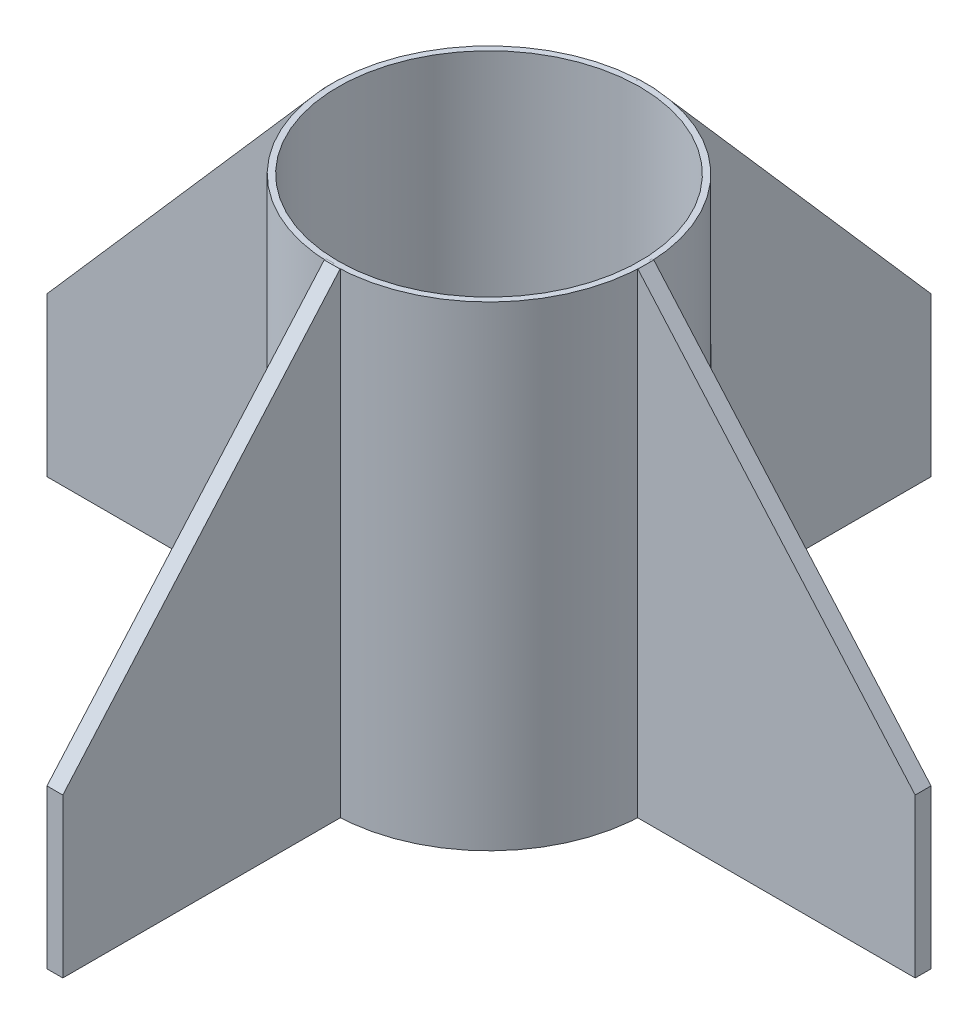
ISO-10303-21;
HEADER;
FILE_DESCRIPTION(('STEP AP214'),'2;1');
FILE_NAME('part.step','',(''),(''),'','','');
FILE_SCHEMA(('AUTOMOTIVE_DESIGN { 1 0 10303 214 1 1 1 1 }'));
ENDSEC;
DATA;
#1=APPLICATION_CONTEXT('core data for automotive mechanical design processes');
#2=APPLICATION_PROTOCOL_DEFINITION('international standard','automotive_design',2000,#1);
#3=PRODUCT_CONTEXT('',#1,'mechanical');
#4=PRODUCT('Part','Part','',(#3));
#5=PRODUCT_RELATED_PRODUCT_CATEGORY('part','',(#4));
#6=PRODUCT_DEFINITION_FORMATION('','',#4);
#7=PRODUCT_DEFINITION_CONTEXT('part definition',#1,'design');
#8=PRODUCT_DEFINITION('design','',#6,#7);
#9=PRODUCT_DEFINITION_SHAPE('','',#8);
#10=(LENGTH_UNIT() NAMED_UNIT(*) SI_UNIT(.MILLI.,.METRE.));
#11=(NAMED_UNIT(*) PLANE_ANGLE_UNIT() SI_UNIT($,.RADIAN.));
#12=(NAMED_UNIT(*) SI_UNIT($,.STERADIAN.) SOLID_ANGLE_UNIT());
#13=UNCERTAINTY_MEASURE_WITH_UNIT(LENGTH_MEASURE(1.E-05),#10,'distance_accuracy_value','');
#14=(GEOMETRIC_REPRESENTATION_CONTEXT(3) GLOBAL_UNCERTAINTY_ASSIGNED_CONTEXT((#13)) GLOBAL_UNIT_ASSIGNED_CONTEXT((#10,
#11,#12)) REPRESENTATION_CONTEXT('',''));
#15=CARTESIAN_POINT('',(0.,0.,0.));
#16=DIRECTION('',(0.,0.,1.));
#17=DIRECTION('',(1.,0.,0.));
#18=AXIS2_PLACEMENT_3D('',#15,#16,#17);
#19=CARTESIAN_POINT('',(-1.99999999999959,0.,-39.6));
#20=DIRECTION('',(0.,-1.,0.));
#21=DIRECTION('',(-1.,0.,0.));
#22=AXIS2_PLACEMENT_3D('',#19,#20,#21);
#23=PLANE('',#22);
#24=DIRECTION('',(1.,0.,0.));
#25=VECTOR('',#24,1.);
#26=CARTESIAN_POINT('',(-1.99999999999885,0.,-109.6));
#27=LINE('',#26,#25);
#28=CARTESIAN_POINT('',(-1.99999999999885,0.,-109.6));
#29=VERTEX_POINT('',#28);
#30=CARTESIAN_POINT('',(2.00000000000115,0.,-109.6));
#31=VERTEX_POINT('',#30);
#32=EDGE_CURVE('E52',#29,#31,#27,.T.);
#33=ORIENTED_EDGE('',*,*,#32,.T.);
#34=DIRECTION('',(0.,0.,-1.));
#35=VECTOR('',#34,1.);
#36=CARTESIAN_POINT('',(2.00000000000041,0.,-39.6));
#37=LINE('',#36,#35);
#38=CARTESIAN_POINT('',(2.00000000000041,0.,-39.1));
#39=VERTEX_POINT('',#38);
#40=EDGE_CURVE('E108',#39,#31,#37,.T.);
#41=ORIENTED_EDGE('',*,*,#40,.F.);
#42=DIRECTION('',(1.,0.,0.));
#43=VECTOR('',#42,1.);
#44=CARTESIAN_POINT('',(-1.99999999999959,0.,-39.1));
#45=LINE('',#44,#43);
#46=CARTESIAN_POINT('',(-1.99999999999959,0.,-39.1));
#47=VERTEX_POINT('',#46);
#48=EDGE_CURVE('E106',#47,#39,#45,.T.);
#49=ORIENTED_EDGE('',*,*,#48,.F.);
#50=DIRECTION('',(0.,0.,-1.));
#51=VECTOR('',#50,1.);
#52=CARTESIAN_POINT('',(-1.99999999999959,0.,-39.6));
#53=LINE('',#52,#51);
#54=EDGE_CURVE('E94',#47,#29,#53,.T.);
#55=ORIENTED_EDGE('',*,*,#54,.T.);
#56=EDGE_LOOP('',(#33,#41,#49,#55));
#57=FACE_BOUND('',#56,.T.);
#58=ADVANCED_FACE('F49',(#57),#23,.T.);
#59=CARTESIAN_POINT('',(-1.99999999999885,40.,-109.6));
#60=DIRECTION('',(0.,0.658504607868518,-0.752576694706878));
#61=DIRECTION('',(0.,0.752576694706878,0.658504607868518));
#62=AXIS2_PLACEMENT_3D('',#59,#60,#61);
#63=PLANE('',#62);
#64=DIRECTION('',(1.,0.,0.));
#65=VECTOR('',#64,1.);
#66=CARTESIAN_POINT('',(-1.99999999999959,120.,-39.6));
#67=LINE('',#66,#65);
#68=CARTESIAN_POINT('',(-1.99999999999959,120.,-39.6));
#69=VERTEX_POINT('',#68);
#70=CARTESIAN_POINT('',(2.00000000000041,120.,-39.6));
#71=VERTEX_POINT('',#70);
#72=EDGE_CURVE('E12',#69,#71,#67,.T.);
#73=ORIENTED_EDGE('',*,*,#72,.T.);
#74=DIRECTION('',(0.,0.752576694706878,0.658504607868518));
#75=VECTOR('',#74,1.);
#76=CARTESIAN_POINT('',(2.00000000000115,40.,-109.6));
#77=LINE('',#76,#75);
#78=CARTESIAN_POINT('',(2.00000000000115,40.,-109.6));
#79=VERTEX_POINT('',#78);
#80=EDGE_CURVE('E103',#79,#71,#77,.T.);
#81=ORIENTED_EDGE('',*,*,#80,.F.);
#82=DIRECTION('',(1.,0.,0.));
#83=VECTOR('',#82,1.);
#84=CARTESIAN_POINT('',(-1.99999999999885,40.,-109.6));
#85=LINE('',#84,#83);
#86=CARTESIAN_POINT('',(-1.99999999999885,40.,-109.6));
#87=VERTEX_POINT('',#86);
#88=EDGE_CURVE('E57',#87,#79,#85,.T.);
#89=ORIENTED_EDGE('',*,*,#88,.F.);
#90=DIRECTION('',(0.,0.752576694706878,0.658504607868518));
#91=VECTOR('',#90,1.);
#92=CARTESIAN_POINT('',(-1.99999999999885,40.,-109.6));
#93=LINE('',#92,#91);
#94=EDGE_CURVE('E64',#87,#69,#93,.T.);
#95=ORIENTED_EDGE('',*,*,#94,.T.);
#96=EDGE_LOOP('',(#73,#81,#89,#95));
#97=FACE_BOUND('',#96,.T.);
#98=ADVANCED_FACE('F141',(#97),#63,.T.);
#99=CARTESIAN_POINT('',(-1.99999999999885,0.,-109.6));
#100=DIRECTION('',(0.,0.,-1.));
#101=DIRECTION('',(-1.,0.,0.));
#102=AXIS2_PLACEMENT_3D('',#99,#100,#101);
#103=PLANE('',#102);
#104=ORIENTED_EDGE('',*,*,#88,.T.);
#105=DIRECTION('',(0.,1.,0.));
#106=VECTOR('',#105,1.);
#107=CARTESIAN_POINT('',(2.00000000000115,0.,-109.6));
#108=LINE('',#107,#106);
#109=EDGE_CURVE('E127',#31,#79,#108,.T.);
#110=ORIENTED_EDGE('',*,*,#109,.F.);
#111=ORIENTED_EDGE('',*,*,#32,.F.);
#112=DIRECTION('',(0.,1.,0.));
#113=VECTOR('',#112,1.);
#114=CARTESIAN_POINT('',(-1.99999999999885,0.,-109.6));
#115=LINE('',#114,#113);
#116=EDGE_CURVE('E101',#29,#87,#115,.T.);
#117=ORIENTED_EDGE('',*,*,#116,.T.);
#118=EDGE_LOOP('',(#104,#110,#111,#117));
#119=FACE_BOUND('',#118,.T.);
#120=ADVANCED_FACE('F135',(#119),#103,.T.);
#121=CARTESIAN_POINT('',(-2.,0.,0.));
#122=DIRECTION('',(1.,0.,0.));
#123=DIRECTION('',(0.,0.,-1.));
#124=AXIS2_PLACEMENT_3D('',#121,#122,#123);
#125=PLANE('',#124);
#126=ORIENTED_EDGE('',*,*,#54,.F.);
#127=DIRECTION('',(0.,-1.,0.));
#128=VECTOR('',#127,1.);
#129=CARTESIAN_POINT('',(-1.99999999999959,120.,-39.1));
#130=LINE('',#129,#128);
#131=CARTESIAN_POINT('',(-1.99999999999959,120.,-39.1));
#132=VERTEX_POINT('',#131);
#133=EDGE_CURVE('E99',#132,#47,#130,.T.);
#134=ORIENTED_EDGE('',*,*,#133,.F.);
#135=DIRECTION('',(0.,0.,-1.));
#136=VECTOR('',#135,1.);
#137=CARTESIAN_POINT('',(-1.99999999999959,120.,-39.1));
#138=LINE('',#137,#136);
#139=EDGE_CURVE('E121',#132,#69,#138,.T.);
#140=ORIENTED_EDGE('',*,*,#139,.T.);
#141=ORIENTED_EDGE('',*,*,#94,.F.);
#142=ORIENTED_EDGE('',*,*,#116,.F.);
#143=EDGE_LOOP('',(#126,#134,#140,#141,#142));
#144=FACE_BOUND('',#143,.T.);
#145=ADVANCED_FACE('F96',(#144),#125,.F.);
#146=CARTESIAN_POINT('',(2.,0.,0.));
#147=DIRECTION('',(1.,0.,0.));
#148=DIRECTION('',(0.,0.,-1.));
#149=AXIS2_PLACEMENT_3D('',#146,#147,#148);
#150=PLANE('',#149);
#151=ORIENTED_EDGE('',*,*,#40,.T.);
#152=ORIENTED_EDGE('',*,*,#109,.T.);
#153=ORIENTED_EDGE('',*,*,#80,.T.);
#154=DIRECTION('',(0.,0.,-1.));
#155=VECTOR('',#154,1.);
#156=CARTESIAN_POINT('',(2.00000000000041,120.,-39.1));
#157=LINE('',#156,#155);
#158=CARTESIAN_POINT('',(2.00000000000041,120.,-39.1));
#159=VERTEX_POINT('',#158);
#160=EDGE_CURVE('E123',#159,#71,#157,.T.);
#161=ORIENTED_EDGE('',*,*,#160,.F.);
#162=DIRECTION('',(0.,1.,0.));
#163=VECTOR('',#162,1.);
#164=CARTESIAN_POINT('',(2.00000000000041,120.,-39.1));
#165=LINE('',#164,#163);
#166=EDGE_CURVE('E111',#39,#159,#165,.T.);
#167=ORIENTED_EDGE('',*,*,#166,.F.);
#168=EDGE_LOOP('',(#151,#152,#153,#161,#167));
#169=FACE_BOUND('',#168,.T.);
#170=ADVANCED_FACE('F137',(#169),#150,.T.);
#171=CARTESIAN_POINT('',(-1.99999999999959,120.,-39.1));
#172=DIRECTION('',(0.,-1.,0.));
#173=DIRECTION('',(-1.,0.,0.));
#174=AXIS2_PLACEMENT_3D('',#171,#172,#173);
#175=PLANE('',#174);
#176=ORIENTED_EDGE('',*,*,#72,.F.);
#177=ORIENTED_EDGE('',*,*,#139,.F.);
#178=DIRECTION('',(-1.,0.,0.));
#179=VECTOR('',#178,1.);
#180=CARTESIAN_POINT('',(-1.99999999999959,120.,-39.1));
#181=LINE('',#180,#179);
#182=EDGE_CURVE('E115',#159,#132,#181,.T.);
#183=ORIENTED_EDGE('',*,*,#182,.F.);
#184=ORIENTED_EDGE('',*,*,#160,.T.);
#185=EDGE_LOOP('',(#176,#177,#183,#184));
#186=FACE_BOUND('',#185,.T.);
#187=ADVANCED_FACE('F140',(#186),#175,.F.);
#188=CARTESIAN_POINT('',(4.095507610463E-13,0.,-39.1));
#189=DIRECTION('',(0.,0.,1.));
#190=DIRECTION('',(1.,0.,0.));
#191=AXIS2_PLACEMENT_3D('',#188,#189,#190);
#192=PLANE('',#191);
#193=ORIENTED_EDGE('',*,*,#133,.T.);
#194=ORIENTED_EDGE('',*,*,#48,.T.);
#195=ORIENTED_EDGE('',*,*,#166,.T.);
#196=ORIENTED_EDGE('',*,*,#182,.T.);
#197=EDGE_LOOP('',(#193,#194,#195,#196));
#198=FACE_BOUND('',#197,.T.);
#199=ADVANCED_FACE('F113',(#198),#192,.T.);
#200=CLOSED_SHELL('',(#58,#98,#120,#145,#170,#187,#199));
#201=MANIFOLD_SOLID_BREP('B2',#200);
#202=CARTESIAN_POINT('',(-39.6,0.,2.));
#203=DIRECTION('',(0.,-1.,0.));
#204=DIRECTION('',(0.,0.,1.));
#205=AXIS2_PLACEMENT_3D('',#202,#203,#204);
#206=PLANE('',#205);
#207=DIRECTION('',(0.,0.,-1.));
#208=VECTOR('',#207,1.);
#209=CARTESIAN_POINT('',(-109.6,0.,2.));
#210=LINE('',#209,#208);
#211=CARTESIAN_POINT('',(-109.6,0.,2.));
#212=VERTEX_POINT('',#211);
#213=CARTESIAN_POINT('',(-109.6,0.,-2.));
#214=VERTEX_POINT('',#213);
#215=EDGE_CURVE('E220',#212,#214,#210,.T.);
#216=ORIENTED_EDGE('',*,*,#215,.T.);
#217=DIRECTION('',(-1.,0.,0.));
#218=VECTOR('',#217,1.);
#219=CARTESIAN_POINT('',(-39.6,0.,-2.));
#220=LINE('',#219,#218);
#221=CARTESIAN_POINT('',(-39.1,0.,-2.));
#222=VERTEX_POINT('',#221);
#223=EDGE_CURVE('E276',#222,#214,#220,.T.);
#224=ORIENTED_EDGE('',*,*,#223,.F.);
#225=DIRECTION('',(0.,0.,-1.));
#226=VECTOR('',#225,1.);
#227=CARTESIAN_POINT('',(-39.1,0.,2.));
#228=LINE('',#227,#226);
#229=CARTESIAN_POINT('',(-39.1,0.,2.));
#230=VERTEX_POINT('',#229);
#231=EDGE_CURVE('E274',#230,#222,#228,.T.);
#232=ORIENTED_EDGE('',*,*,#231,.F.);
#233=DIRECTION('',(-1.,0.,0.));
#234=VECTOR('',#233,1.);
#235=CARTESIAN_POINT('',(-39.6,0.,2.));
#236=LINE('',#235,#234);
#237=EDGE_CURVE('E262',#230,#212,#236,.T.);
#238=ORIENTED_EDGE('',*,*,#237,.T.);
#239=EDGE_LOOP('',(#216,#224,#232,#238));
#240=FACE_BOUND('',#239,.T.);
#241=ADVANCED_FACE('F217',(#240),#206,.T.);
#242=CARTESIAN_POINT('',(-109.6,40.,2.));
#243=DIRECTION('',(-0.752576694706878,0.658504607868518,0.));
#244=DIRECTION('',(0.658504607868518,0.752576694706878,0.));
#245=AXIS2_PLACEMENT_3D('',#242,#243,#244);
#246=PLANE('',#245);
#247=DIRECTION('',(0.,0.,-1.));
#248=VECTOR('',#247,1.);
#249=CARTESIAN_POINT('',(-39.6,120.,2.));
#250=LINE('',#249,#248);
#251=CARTESIAN_POINT('',(-39.6,120.,2.));
#252=VERTEX_POINT('',#251);
#253=CARTESIAN_POINT('',(-39.6,120.,-2.));
#254=VERTEX_POINT('',#253);
#255=EDGE_CURVE('E47',#252,#254,#250,.T.);
#256=ORIENTED_EDGE('',*,*,#255,.T.);
#257=DIRECTION('',(0.658504607868518,0.752576694706878,0.));
#258=VECTOR('',#257,1.);
#259=CARTESIAN_POINT('',(-109.6,40.,-2.));
#260=LINE('',#259,#258);
#261=CARTESIAN_POINT('',(-109.6,40.,-2.));
#262=VERTEX_POINT('',#261);
#263=EDGE_CURVE('E271',#262,#254,#260,.T.);
#264=ORIENTED_EDGE('',*,*,#263,.F.);
#265=DIRECTION('',(0.,0.,-1.));
#266=VECTOR('',#265,1.);
#267=CARTESIAN_POINT('',(-109.6,40.,2.));
#268=LINE('',#267,#266);
#269=CARTESIAN_POINT('',(-109.6,40.,2.));
#270=VERTEX_POINT('',#269);
#271=EDGE_CURVE('E225',#270,#262,#268,.T.);
#272=ORIENTED_EDGE('',*,*,#271,.F.);
#273=DIRECTION('',(0.658504607868518,0.752576694706878,0.));
#274=VECTOR('',#273,1.);
#275=CARTESIAN_POINT('',(-109.6,40.,2.));
#276=LINE('',#275,#274);
#277=EDGE_CURVE('E232',#270,#252,#276,.T.);
#278=ORIENTED_EDGE('',*,*,#277,.T.);
#279=EDGE_LOOP('',(#256,#264,#272,#278));
#280=FACE_BOUND('',#279,.T.);
#281=ADVANCED_FACE('F309',(#280),#246,.T.);
#282=CARTESIAN_POINT('',(-109.6,0.,2.));
#283=DIRECTION('',(-1.,0.,0.));
#284=DIRECTION('',(0.,0.,1.));
#285=AXIS2_PLACEMENT_3D('',#282,#283,#284);
#286=PLANE('',#285);
#287=ORIENTED_EDGE('',*,*,#271,.T.);
#288=DIRECTION('',(0.,1.,0.));
#289=VECTOR('',#288,1.);
#290=CARTESIAN_POINT('',(-109.6,0.,-2.));
#291=LINE('',#290,#289);
#292=EDGE_CURVE('E295',#214,#262,#291,.T.);
#293=ORIENTED_EDGE('',*,*,#292,.F.);
#294=ORIENTED_EDGE('',*,*,#215,.F.);
#295=DIRECTION('',(0.,1.,0.));
#296=VECTOR('',#295,1.);
#297=CARTESIAN_POINT('',(-109.6,0.,2.));
#298=LINE('',#297,#296);
#299=EDGE_CURVE('E269',#212,#270,#298,.T.);
#300=ORIENTED_EDGE('',*,*,#299,.T.);
#301=EDGE_LOOP('',(#287,#293,#294,#300));
#302=FACE_BOUND('',#301,.T.);
#303=ADVANCED_FACE('F303',(#302),#286,.T.);
#304=CARTESIAN_POINT('',(0.,0.,2.));
#305=DIRECTION('',(0.,0.,-1.));
#306=DIRECTION('',(-1.,0.,0.));
#307=AXIS2_PLACEMENT_3D('',#304,#305,#306);
#308=PLANE('',#307);
#309=ORIENTED_EDGE('',*,*,#237,.F.);
#310=DIRECTION('',(0.,-1.,0.));
#311=VECTOR('',#310,1.);
#312=CARTESIAN_POINT('',(-39.1,120.,2.));
#313=LINE('',#312,#311);
#314=CARTESIAN_POINT('',(-39.1,120.,2.));
#315=VERTEX_POINT('',#314);
#316=EDGE_CURVE('E267',#315,#230,#313,.T.);
#317=ORIENTED_EDGE('',*,*,#316,.F.);
#318=DIRECTION('',(-1.,0.,0.));
#319=VECTOR('',#318,1.);
#320=CARTESIAN_POINT('',(-39.1,120.,2.));
#321=LINE('',#320,#319);
#322=EDGE_CURVE('E289',#315,#252,#321,.T.);
#323=ORIENTED_EDGE('',*,*,#322,.T.);
#324=ORIENTED_EDGE('',*,*,#277,.F.);
#325=ORIENTED_EDGE('',*,*,#299,.F.);
#326=EDGE_LOOP('',(#309,#317,#323,#324,#325));
#327=FACE_BOUND('',#326,.T.);
#328=ADVANCED_FACE('F264',(#327),#308,.F.);
#329=CARTESIAN_POINT('',(0.,0.,-2.));
#330=DIRECTION('',(0.,0.,-1.));
#331=DIRECTION('',(-1.,0.,0.));
#332=AXIS2_PLACEMENT_3D('',#329,#330,#331);
#333=PLANE('',#332);
#334=ORIENTED_EDGE('',*,*,#223,.T.);
#335=ORIENTED_EDGE('',*,*,#292,.T.);
#336=ORIENTED_EDGE('',*,*,#263,.T.);
#337=DIRECTION('',(-1.,0.,0.));
#338=VECTOR('',#337,1.);
#339=CARTESIAN_POINT('',(-39.1,120.,-2.));
#340=LINE('',#339,#338);
#341=CARTESIAN_POINT('',(-39.1,120.,-2.));
#342=VERTEX_POINT('',#341);
#343=EDGE_CURVE('E291',#342,#254,#340,.T.);
#344=ORIENTED_EDGE('',*,*,#343,.F.);
#345=DIRECTION('',(0.,1.,0.));
#346=VECTOR('',#345,1.);
#347=CARTESIAN_POINT('',(-39.1,120.,-2.));
#348=LINE('',#347,#346);
#349=EDGE_CURVE('E279',#222,#342,#348,.T.);
#350=ORIENTED_EDGE('',*,*,#349,.F.);
#351=EDGE_LOOP('',(#334,#335,#336,#344,#350));
#352=FACE_BOUND('',#351,.T.);
#353=ADVANCED_FACE('F305',(#352),#333,.T.);
#354=CARTESIAN_POINT('',(-39.1,120.,2.));
#355=DIRECTION('',(0.,-1.,0.));
#356=DIRECTION('',(0.,0.,1.));
#357=AXIS2_PLACEMENT_3D('',#354,#355,#356);
#358=PLANE('',#357);
#359=ORIENTED_EDGE('',*,*,#255,.F.);
#360=ORIENTED_EDGE('',*,*,#322,.F.);
#361=DIRECTION('',(0.,0.,1.));
#362=VECTOR('',#361,1.);
#363=CARTESIAN_POINT('',(-39.1,120.,2.));
#364=LINE('',#363,#362);
#365=EDGE_CURVE('E283',#342,#315,#364,.T.);
#366=ORIENTED_EDGE('',*,*,#365,.F.);
#367=ORIENTED_EDGE('',*,*,#343,.T.);
#368=EDGE_LOOP('',(#359,#360,#366,#367));
#369=FACE_BOUND('',#368,.T.);
#370=ADVANCED_FACE('F308',(#369),#358,.F.);
#371=CARTESIAN_POINT('',(-39.1,0.,0.));
#372=DIRECTION('',(1.,0.,0.));
#373=DIRECTION('',(0.,0.,-1.));
#374=AXIS2_PLACEMENT_3D('',#371,#372,#373);
#375=PLANE('',#374);
#376=ORIENTED_EDGE('',*,*,#316,.T.);
#377=ORIENTED_EDGE('',*,*,#231,.T.);
#378=ORIENTED_EDGE('',*,*,#349,.T.);
#379=ORIENTED_EDGE('',*,*,#365,.T.);
#380=EDGE_LOOP('',(#376,#377,#378,#379));
#381=FACE_BOUND('',#380,.T.);
#382=ADVANCED_FACE('F281',(#381),#375,.T.);
#383=CLOSED_SHELL('',(#241,#281,#303,#328,#353,#370,#382));
#384=MANIFOLD_SOLID_BREP('B6',#383);
#385=CARTESIAN_POINT('',(1.99999999999986,0.,39.6));
#386=DIRECTION('',(0.,-1.,0.));
#387=DIRECTION('',(1.,0.,0.));
#388=AXIS2_PLACEMENT_3D('',#385,#386,#387);
#389=PLANE('',#388);
#390=DIRECTION('',(-1.,0.,0.));
#391=VECTOR('',#390,1.);
#392=CARTESIAN_POINT('',(1.99999999999962,0.,109.6));
#393=LINE('',#392,#391);
#394=CARTESIAN_POINT('',(1.99999999999962,0.,109.6));
#395=VERTEX_POINT('',#394);
#396=CARTESIAN_POINT('',(-2.00000000000038,0.,109.6));
#397=VERTEX_POINT('',#396);
#398=EDGE_CURVE('E388',#395,#397,#393,.T.);
#399=ORIENTED_EDGE('',*,*,#398,.T.);
#400=DIRECTION('',(0.,0.,1.));
#401=VECTOR('',#400,1.);
#402=CARTESIAN_POINT('',(-2.00000000000014,0.,39.6));
#403=LINE('',#402,#401);
#404=CARTESIAN_POINT('',(-2.00000000000014,0.,39.1));
#405=VERTEX_POINT('',#404);
#406=EDGE_CURVE('E444',#405,#397,#403,.T.);
#407=ORIENTED_EDGE('',*,*,#406,.F.);
#408=DIRECTION('',(-1.,0.,0.));
#409=VECTOR('',#408,1.);
#410=CARTESIAN_POINT('',(1.99999999999986,0.,39.1));
#411=LINE('',#410,#409);
#412=CARTESIAN_POINT('',(1.99999999999986,0.,39.1));
#413=VERTEX_POINT('',#412);
#414=EDGE_CURVE('E442',#413,#405,#411,.T.);
#415=ORIENTED_EDGE('',*,*,#414,.F.);
#416=DIRECTION('',(0.,0.,1.));
#417=VECTOR('',#416,1.);
#418=CARTESIAN_POINT('',(1.99999999999986,0.,39.6));
#419=LINE('',#418,#417);
#420=EDGE_CURVE('E430',#413,#395,#419,.T.);
#421=ORIENTED_EDGE('',*,*,#420,.T.);
#422=EDGE_LOOP('',(#399,#407,#415,#421));
#423=FACE_BOUND('',#422,.T.);
#424=ADVANCED_FACE('F385',(#423),#389,.T.);
#425=CARTESIAN_POINT('',(1.99999999999962,40.,109.6));
#426=DIRECTION('',(0.,0.658504607868518,0.752576694706878));
#427=DIRECTION('',(0.,0.752576694706878,-0.658504607868518));
#428=AXIS2_PLACEMENT_3D('',#425,#426,#427);
#429=PLANE('',#428);
#430=DIRECTION('',(-1.,0.,0.));
#431=VECTOR('',#430,1.);
#432=CARTESIAN_POINT('',(1.99999999999986,120.,39.6));
#433=LINE('',#432,#431);
#434=CARTESIAN_POINT('',(1.99999999999986,120.,39.6));
#435=VERTEX_POINT('',#434);
#436=CARTESIAN_POINT('',(-2.00000000000014,120.,39.6));
#437=VERTEX_POINT('',#436);
#438=EDGE_CURVE('E215',#435,#437,#433,.T.);
#439=ORIENTED_EDGE('',*,*,#438,.T.);
#440=DIRECTION('',(0.,0.752576694706878,-0.658504607868518));
#441=VECTOR('',#440,1.);
#442=CARTESIAN_POINT('',(-2.00000000000038,40.,109.6));
#443=LINE('',#442,#441);
#444=CARTESIAN_POINT('',(-2.00000000000038,40.,109.6));
#445=VERTEX_POINT('',#444);
#446=EDGE_CURVE('E439',#445,#437,#443,.T.);
#447=ORIENTED_EDGE('',*,*,#446,.F.);
#448=DIRECTION('',(-1.,0.,0.));
#449=VECTOR('',#448,1.);
#450=CARTESIAN_POINT('',(1.99999999999962,40.,109.6));
#451=LINE('',#450,#449);
#452=CARTESIAN_POINT('',(1.99999999999962,40.,109.6));
#453=VERTEX_POINT('',#452);
#454=EDGE_CURVE('E393',#453,#445,#451,.T.);
#455=ORIENTED_EDGE('',*,*,#454,.F.);
#456=DIRECTION('',(0.,0.752576694706878,-0.658504607868518));
#457=VECTOR('',#456,1.);
#458=CARTESIAN_POINT('',(1.99999999999962,40.,109.6));
#459=LINE('',#458,#457);
#460=EDGE_CURVE('E400',#453,#435,#459,.T.);
#461=ORIENTED_EDGE('',*,*,#460,.T.);
#462=EDGE_LOOP('',(#439,#447,#455,#461));
#463=FACE_BOUND('',#462,.T.);
#464=ADVANCED_FACE('F477',(#463),#429,.T.);
#465=CARTESIAN_POINT('',(1.99999999999962,0.,109.6));
#466=DIRECTION('',(0.,0.,1.));
#467=DIRECTION('',(1.,0.,0.));
#468=AXIS2_PLACEMENT_3D('',#465,#466,#467);
#469=PLANE('',#468);
#470=ORIENTED_EDGE('',*,*,#454,.T.);
#471=DIRECTION('',(0.,1.,0.));
#472=VECTOR('',#471,1.);
#473=CARTESIAN_POINT('',(-2.00000000000038,0.,109.6));
#474=LINE('',#473,#472);
#475=EDGE_CURVE('E463',#397,#445,#474,.T.);
#476=ORIENTED_EDGE('',*,*,#475,.F.);
#477=ORIENTED_EDGE('',*,*,#398,.F.);
#478=DIRECTION('',(0.,1.,0.));
#479=VECTOR('',#478,1.);
#480=CARTESIAN_POINT('',(1.99999999999962,0.,109.6));
#481=LINE('',#480,#479);
#482=EDGE_CURVE('E437',#395,#453,#481,.T.);
#483=ORIENTED_EDGE('',*,*,#482,.T.);
#484=EDGE_LOOP('',(#470,#476,#477,#483));
#485=FACE_BOUND('',#484,.T.);
#486=ADVANCED_FACE('F471',(#485),#469,.T.);
#487=CARTESIAN_POINT('',(2.,0.,0.));
#488=DIRECTION('',(-1.,0.,0.));
#489=DIRECTION('',(0.,0.,1.));
#490=AXIS2_PLACEMENT_3D('',#487,#488,#489);
#491=PLANE('',#490);
#492=ORIENTED_EDGE('',*,*,#420,.F.);
#493=DIRECTION('',(0.,-1.,0.));
#494=VECTOR('',#493,1.);
#495=CARTESIAN_POINT('',(1.99999999999986,120.,39.1));
#496=LINE('',#495,#494);
#497=CARTESIAN_POINT('',(1.99999999999986,120.,39.1));
#498=VERTEX_POINT('',#497);
#499=EDGE_CURVE('E435',#498,#413,#496,.T.);
#500=ORIENTED_EDGE('',*,*,#499,.F.);
#501=DIRECTION('',(0.,0.,1.));
#502=VECTOR('',#501,1.);
#503=CARTESIAN_POINT('',(1.99999999999986,120.,39.1));
#504=LINE('',#503,#502);
#505=EDGE_CURVE('E457',#498,#435,#504,.T.);
#506=ORIENTED_EDGE('',*,*,#505,.T.);
#507=ORIENTED_EDGE('',*,*,#460,.F.);
#508=ORIENTED_EDGE('',*,*,#482,.F.);
#509=EDGE_LOOP('',(#492,#500,#506,#507,#508));
#510=FACE_BOUND('',#509,.T.);
#511=ADVANCED_FACE('F432',(#510),#491,.F.);
#512=CARTESIAN_POINT('',(-2.,0.,0.));
#513=DIRECTION('',(-1.,0.,0.));
#514=DIRECTION('',(0.,0.,1.));
#515=AXIS2_PLACEMENT_3D('',#512,#513,#514);
#516=PLANE('',#515);
#517=ORIENTED_EDGE('',*,*,#406,.T.);
#518=ORIENTED_EDGE('',*,*,#475,.T.);
#519=ORIENTED_EDGE('',*,*,#446,.T.);
#520=DIRECTION('',(0.,0.,1.));
#521=VECTOR('',#520,1.);
#522=CARTESIAN_POINT('',(-2.00000000000014,120.,39.1));
#523=LINE('',#522,#521);
#524=CARTESIAN_POINT('',(-2.00000000000014,120.,39.1));
#525=VERTEX_POINT('',#524);
#526=EDGE_CURVE('E459',#525,#437,#523,.T.);
#527=ORIENTED_EDGE('',*,*,#526,.F.);
#528=DIRECTION('',(0.,1.,0.));
#529=VECTOR('',#528,1.);
#530=CARTESIAN_POINT('',(-2.00000000000014,120.,39.1));
#531=LINE('',#530,#529);
#532=EDGE_CURVE('E447',#405,#525,#531,.T.);
#533=ORIENTED_EDGE('',*,*,#532,.F.);
#534=EDGE_LOOP('',(#517,#518,#519,#527,#533));
#535=FACE_BOUND('',#534,.T.);
#536=ADVANCED_FACE('F473',(#535),#516,.T.);
#537=CARTESIAN_POINT('',(1.99999999999986,120.,39.1));
#538=DIRECTION('',(0.,-1.,0.));
#539=DIRECTION('',(1.,0.,0.));
#540=AXIS2_PLACEMENT_3D('',#537,#538,#539);
#541=PLANE('',#540);
#542=ORIENTED_EDGE('',*,*,#438,.F.);
#543=ORIENTED_EDGE('',*,*,#505,.F.);
#544=DIRECTION('',(1.,0.,0.));
#545=VECTOR('',#544,1.);
#546=CARTESIAN_POINT('',(1.99999999999986,120.,39.1));
#547=LINE('',#546,#545);
#548=EDGE_CURVE('E451',#525,#498,#547,.T.);
#549=ORIENTED_EDGE('',*,*,#548,.F.);
#550=ORIENTED_EDGE('',*,*,#526,.T.);
#551=EDGE_LOOP('',(#542,#543,#549,#550));
#552=FACE_BOUND('',#551,.T.);
#553=ADVANCED_FACE('F476',(#552),#541,.F.);
#554=CARTESIAN_POINT('',(-1.36516920348767E-13,0.,39.1));
#555=DIRECTION('',(0.,0.,-1.));
#556=DIRECTION('',(-1.,0.,0.));
#557=AXIS2_PLACEMENT_3D('',#554,#555,#556);
#558=PLANE('',#557);
#559=ORIENTED_EDGE('',*,*,#499,.T.);
#560=ORIENTED_EDGE('',*,*,#414,.T.);
#561=ORIENTED_EDGE('',*,*,#532,.T.);
#562=ORIENTED_EDGE('',*,*,#548,.T.);
#563=EDGE_LOOP('',(#559,#560,#561,#562));
#564=FACE_BOUND('',#563,.T.);
#565=ADVANCED_FACE('F449',(#564),#558,.T.);
#566=CLOSED_SHELL('',(#424,#464,#486,#511,#536,#553,#565));
#567=MANIFOLD_SOLID_BREP('B41',#566);
#568=CARTESIAN_POINT('',(39.6,0.,-2.));
#569=DIRECTION('',(0.,-1.,0.));
#570=DIRECTION('',(0.,0.,-1.));
#571=AXIS2_PLACEMENT_3D('',#568,#569,#570);
#572=PLANE('',#571);
#573=DIRECTION('',(0.,0.,1.));
#574=VECTOR('',#573,1.);
#575=CARTESIAN_POINT('',(109.6,0.,-2.));
#576=LINE('',#575,#574);
#577=CARTESIAN_POINT('',(109.6,0.,-2.));
#578=VERTEX_POINT('',#577);
#579=CARTESIAN_POINT('',(109.6,0.,2.));
#580=VERTEX_POINT('',#579);
#581=EDGE_CURVE('E553',#578,#580,#576,.T.);
#582=ORIENTED_EDGE('',*,*,#581,.T.);
#583=DIRECTION('',(1.,0.,0.));
#584=VECTOR('',#583,1.);
#585=CARTESIAN_POINT('',(39.6,0.,2.));
#586=LINE('',#585,#584);
#587=CARTESIAN_POINT('',(39.1,0.,2.));
#588=VERTEX_POINT('',#587);
#589=EDGE_CURVE('E609',#588,#580,#586,.T.);
#590=ORIENTED_EDGE('',*,*,#589,.F.);
#591=DIRECTION('',(0.,0.,1.));
#592=VECTOR('',#591,1.);
#593=CARTESIAN_POINT('',(39.1,0.,-2.));
#594=LINE('',#593,#592);
#595=CARTESIAN_POINT('',(39.1,0.,-2.));
#596=VERTEX_POINT('',#595);
#597=EDGE_CURVE('E607',#596,#588,#594,.T.);
#598=ORIENTED_EDGE('',*,*,#597,.F.);
#599=DIRECTION('',(1.,0.,0.));
#600=VECTOR('',#599,1.);
#601=CARTESIAN_POINT('',(39.6,0.,-2.));
#602=LINE('',#601,#600);
#603=EDGE_CURVE('E595',#596,#578,#602,.T.);
#604=ORIENTED_EDGE('',*,*,#603,.T.);
#605=EDGE_LOOP('',(#582,#590,#598,#604));
#606=FACE_BOUND('',#605,.T.);
#607=ADVANCED_FACE('F550',(#606),#572,.T.);
#608=CARTESIAN_POINT('',(109.6,40.,-2.));
#609=DIRECTION('',(0.752576694706878,0.658504607868518,0.));
#610=DIRECTION('',(-0.658504607868518,0.752576694706878,0.));
#611=AXIS2_PLACEMENT_3D('',#608,#609,#610);
#612=PLANE('',#611);
#613=DIRECTION('',(0.,0.,1.));
#614=VECTOR('',#613,1.);
#615=CARTESIAN_POINT('',(39.6,120.,-2.));
#616=LINE('',#615,#614);
#617=CARTESIAN_POINT('',(39.6,120.,-2.));
#618=VERTEX_POINT('',#617);
#619=CARTESIAN_POINT('',(39.6,120.,2.));
#620=VERTEX_POINT('',#619);
#621=EDGE_CURVE('E383',#618,#620,#616,.T.);
#622=ORIENTED_EDGE('',*,*,#621,.T.);
#623=DIRECTION('',(-0.658504607868518,0.752576694706878,0.));
#624=VECTOR('',#623,1.);
#625=CARTESIAN_POINT('',(109.6,40.,2.));
#626=LINE('',#625,#624);
#627=CARTESIAN_POINT('',(109.6,40.,2.));
#628=VERTEX_POINT('',#627);
#629=EDGE_CURVE('E604',#628,#620,#626,.T.);
#630=ORIENTED_EDGE('',*,*,#629,.F.);
#631=DIRECTION('',(0.,0.,1.));
#632=VECTOR('',#631,1.);
#633=CARTESIAN_POINT('',(109.6,40.,-2.));
#634=LINE('',#633,#632);
#635=CARTESIAN_POINT('',(109.6,40.,-2.));
#636=VERTEX_POINT('',#635);
#637=EDGE_CURVE('E558',#636,#628,#634,.T.);
#638=ORIENTED_EDGE('',*,*,#637,.F.);
#639=DIRECTION('',(-0.658504607868518,0.752576694706878,0.));
#640=VECTOR('',#639,1.);
#641=CARTESIAN_POINT('',(109.6,40.,-2.));
#642=LINE('',#641,#640);
#643=EDGE_CURVE('E565',#636,#618,#642,.T.);
#644=ORIENTED_EDGE('',*,*,#643,.T.);
#645=EDGE_LOOP('',(#622,#630,#638,#644));
#646=FACE_BOUND('',#645,.T.);
#647=ADVANCED_FACE('F642',(#646),#612,.T.);
#648=CARTESIAN_POINT('',(109.6,0.,-2.));
#649=DIRECTION('',(1.,0.,0.));
#650=DIRECTION('',(0.,0.,-1.));
#651=AXIS2_PLACEMENT_3D('',#648,#649,#650);
#652=PLANE('',#651);
#653=ORIENTED_EDGE('',*,*,#637,.T.);
#654=DIRECTION('',(0.,1.,0.));
#655=VECTOR('',#654,1.);
#656=CARTESIAN_POINT('',(109.6,0.,2.));
#657=LINE('',#656,#655);
#658=EDGE_CURVE('E628',#580,#628,#657,.T.);
#659=ORIENTED_EDGE('',*,*,#658,.F.);
#660=ORIENTED_EDGE('',*,*,#581,.F.);
#661=DIRECTION('',(0.,1.,0.));
#662=VECTOR('',#661,1.);
#663=CARTESIAN_POINT('',(109.6,0.,-2.));
#664=LINE('',#663,#662);
#665=EDGE_CURVE('E602',#578,#636,#664,.T.);
#666=ORIENTED_EDGE('',*,*,#665,.T.);
#667=EDGE_LOOP('',(#653,#659,#660,#666));
#668=FACE_BOUND('',#667,.T.);
#669=ADVANCED_FACE('F636',(#668),#652,.T.);
#670=CARTESIAN_POINT('',(0.,0.,-2.));
#671=DIRECTION('',(0.,0.,1.));
#672=DIRECTION('',(1.,0.,0.));
#673=AXIS2_PLACEMENT_3D('',#670,#671,#672);
#674=PLANE('',#673);
#675=ORIENTED_EDGE('',*,*,#603,.F.);
#676=DIRECTION('',(0.,-1.,0.));
#677=VECTOR('',#676,1.);
#678=CARTESIAN_POINT('',(39.1,120.,-2.));
#679=LINE('',#678,#677);
#680=CARTESIAN_POINT('',(39.1,120.,-2.));
#681=VERTEX_POINT('',#680);
#682=EDGE_CURVE('E600',#681,#596,#679,.T.);
#683=ORIENTED_EDGE('',*,*,#682,.F.);
#684=DIRECTION('',(1.,0.,0.));
#685=VECTOR('',#684,1.);
#686=CARTESIAN_POINT('',(39.1,120.,-2.));
#687=LINE('',#686,#685);
#688=EDGE_CURVE('E622',#681,#618,#687,.T.);
#689=ORIENTED_EDGE('',*,*,#688,.T.);
#690=ORIENTED_EDGE('',*,*,#643,.F.);
#691=ORIENTED_EDGE('',*,*,#665,.F.);
#692=EDGE_LOOP('',(#675,#683,#689,#690,#691));
#693=FACE_BOUND('',#692,.T.);
#694=ADVANCED_FACE('F597',(#693),#674,.F.);
#695=CARTESIAN_POINT('',(0.,0.,2.));
#696=DIRECTION('',(0.,0.,1.));
#697=DIRECTION('',(1.,0.,0.));
#698=AXIS2_PLACEMENT_3D('',#695,#696,#697);
#699=PLANE('',#698);
#700=ORIENTED_EDGE('',*,*,#589,.T.);
#701=ORIENTED_EDGE('',*,*,#658,.T.);
#702=ORIENTED_EDGE('',*,*,#629,.T.);
#703=DIRECTION('',(1.,0.,0.));
#704=VECTOR('',#703,1.);
#705=CARTESIAN_POINT('',(39.1,120.,2.));
#706=LINE('',#705,#704);
#707=CARTESIAN_POINT('',(39.1,120.,2.));
#708=VERTEX_POINT('',#707);
#709=EDGE_CURVE('E624',#708,#620,#706,.T.);
#710=ORIENTED_EDGE('',*,*,#709,.F.);
#711=DIRECTION('',(0.,1.,0.));
#712=VECTOR('',#711,1.);
#713=CARTESIAN_POINT('',(39.1,120.,2.));
#714=LINE('',#713,#712);
#715=EDGE_CURVE('E612',#588,#708,#714,.T.);
#716=ORIENTED_EDGE('',*,*,#715,.F.);
#717=EDGE_LOOP('',(#700,#701,#702,#710,#716));
#718=FACE_BOUND('',#717,.T.);
#719=ADVANCED_FACE('F638',(#718),#699,.T.);
#720=CARTESIAN_POINT('',(39.1,120.,-2.));
#721=DIRECTION('',(0.,-1.,0.));
#722=DIRECTION('',(0.,0.,-1.));
#723=AXIS2_PLACEMENT_3D('',#720,#721,#722);
#724=PLANE('',#723);
#725=ORIENTED_EDGE('',*,*,#621,.F.);
#726=ORIENTED_EDGE('',*,*,#688,.F.);
#727=DIRECTION('',(0.,0.,-1.));
#728=VECTOR('',#727,1.);
#729=CARTESIAN_POINT('',(39.1,120.,-2.));
#730=LINE('',#729,#728);
#731=EDGE_CURVE('E616',#708,#681,#730,.T.);
#732=ORIENTED_EDGE('',*,*,#731,.F.);
#733=ORIENTED_EDGE('',*,*,#709,.T.);
#734=EDGE_LOOP('',(#725,#726,#732,#733));
#735=FACE_BOUND('',#734,.T.);
#736=ADVANCED_FACE('F641',(#735),#724,.F.);
#737=CARTESIAN_POINT('',(39.1,0.,0.));
#738=DIRECTION('',(-1.,0.,0.));
#739=DIRECTION('',(0.,0.,1.));
#740=AXIS2_PLACEMENT_3D('',#737,#738,#739);
#741=PLANE('',#740);
#742=ORIENTED_EDGE('',*,*,#682,.T.);
#743=ORIENTED_EDGE('',*,*,#597,.T.);
#744=ORIENTED_EDGE('',*,*,#715,.T.);
#745=ORIENTED_EDGE('',*,*,#731,.T.);
#746=EDGE_LOOP('',(#742,#743,#744,#745));
#747=FACE_BOUND('',#746,.T.);
#748=ADVANCED_FACE('F614',(#747),#741,.T.);
#749=CLOSED_SHELL('',(#607,#647,#669,#694,#719,#736,#748));
#750=MANIFOLD_SOLID_BREP('B209',#749);
#751=CARTESIAN_POINT('',(0.,120.,0.));
#752=DIRECTION('',(0.,1.,0.));
#753=DIRECTION('',(0.,0.,1.));
#754=AXIS2_PLACEMENT_3D('',#751,#752,#753);
#755=PLANE('',#754);
#756=CARTESIAN_POINT('',(0.,120.,0.));
#757=DIRECTION('',(0.,1.,0.));
#758=DIRECTION('',(0.,0.,1.));
#759=AXIS2_PLACEMENT_3D('',#756,#757,#758);
#760=CIRCLE('',#759,39.6);
#761=CARTESIAN_POINT('',(0.,120.,39.6));
#762=VERTEX_POINT('',#761);
#763=EDGE_CURVE('E549',#762,#762,#760,.T.);
#764=ORIENTED_EDGE('',*,*,#763,.T.);
#765=EDGE_LOOP('',(#764));
#766=FACE_BOUND('',#765,.T.);
#767=CARTESIAN_POINT('',(0.,120.,0.));
#768=DIRECTION('',(0.,1.,0.));
#769=DIRECTION('',(0.,0.,1.));
#770=AXIS2_PLACEMENT_3D('',#767,#768,#769);
#771=CIRCLE('',#770,38.1);
#772=CARTESIAN_POINT('',(0.,120.,38.1));
#773=VERTEX_POINT('',#772);
#774=EDGE_CURVE('E726',#773,#773,#771,.T.);
#775=ORIENTED_EDGE('',*,*,#774,.F.);
#776=EDGE_LOOP('',(#775));
#777=FACE_BOUND('',#776,.T.);
#778=ADVANCED_FACE('F708',(#766,#777),#755,.T.);
#779=CARTESIAN_POINT('',(0.,0.,0.));
#780=DIRECTION('',(0.,1.,0.));
#781=DIRECTION('',(0.,0.,1.));
#782=AXIS2_PLACEMENT_3D('',#779,#780,#781);
#783=PLANE('',#782);
#784=CARTESIAN_POINT('',(0.,0.,0.));
#785=DIRECTION('',(0.,1.,0.));
#786=DIRECTION('',(0.,0.,1.));
#787=AXIS2_PLACEMENT_3D('',#784,#785,#786);
#788=CIRCLE('',#787,39.6);
#789=CARTESIAN_POINT('',(0.,0.,39.6));
#790=VERTEX_POINT('',#789);
#791=EDGE_CURVE('E721',#790,#790,#788,.T.);
#792=ORIENTED_EDGE('',*,*,#791,.F.);
#793=EDGE_LOOP('',(#792));
#794=FACE_BOUND('',#793,.T.);
#795=CARTESIAN_POINT('',(0.,0.,0.));
#796=DIRECTION('',(0.,1.,0.));
#797=DIRECTION('',(0.,0.,1.));
#798=AXIS2_PLACEMENT_3D('',#795,#796,#797);
#799=CIRCLE('',#798,38.1);
#800=CARTESIAN_POINT('',(0.,0.,38.1));
#801=VERTEX_POINT('',#800);
#802=EDGE_CURVE('E728',#801,#801,#799,.T.);
#803=ORIENTED_EDGE('',*,*,#802,.T.);
#804=EDGE_LOOP('',(#803));
#805=FACE_BOUND('',#804,.T.);
#806=ADVANCED_FACE('F748',(#794,#805),#783,.F.);
#807=CARTESIAN_POINT('',(0.,120.,0.));
#808=DIRECTION('',(0.,-1.,0.));
#809=DIRECTION('',(0.,0.,-1.));
#810=AXIS2_PLACEMENT_3D('',#807,#808,#809);
#811=CYLINDRICAL_SURFACE('',#810,39.6);
#812=CARTESIAN_POINT('',(29.3799068310907,60.,-26.5514797063446));
#813=CARTESIAN_POINT('',(29.3799038079662,59.8877360126508,-26.5514836894051));
#814=CARTESIAN_POINT('',(29.3735421570257,59.7753924470694,-26.5585276462506));
#815=CARTESIAN_POINT('',(29.3482264329291,59.5538045920685,-26.5864993436376));
#816=CARTESIAN_POINT('',(29.3292575292242,59.4445641109657,-26.6074434355692));
#817=CARTESIAN_POINT('',(29.279188055747,59.2324244066187,-26.6625303406707));
#818=CARTESIAN_POINT('',(29.2480936782613,59.1295219776424,-26.6966664168244));
#819=CARTESIAN_POINT('',(29.1745373144712,58.9329480667492,-26.7770298075384));
#820=CARTESIAN_POINT('',(29.132078008523,58.839274415393,-26.8232542710597));
#821=CARTESIAN_POINT('',(29.0367897492995,58.6636927688747,-26.9263766462819));
#822=CARTESIAN_POINT('',(28.9839514798855,58.581795459373,-26.9832841450076));
#823=CARTESIAN_POINT('',(28.8692513070348,58.4321823742864,-27.1059655013533));
#824=CARTESIAN_POINT('',(28.8073890351527,58.3644671780251,-27.1717397209888));
#825=CARTESIAN_POINT('',(28.6761934758985,58.2451110625893,-27.3101631613747));
#826=CARTESIAN_POINT('',(28.6068563443586,58.1934784679656,-27.3828159172546));
#827=CARTESIAN_POINT('',(28.4625641421061,58.1078066433966,-27.5327669836099));
#828=CARTESIAN_POINT('',(28.3876091145494,58.0737672783178,-27.6100652583982));
#829=CARTESIAN_POINT('',(28.2341786630754,58.0242763961422,-27.7669439501689));
#830=CARTESIAN_POINT('',(28.1557063277922,58.0088088899523,-27.846522343596));
#831=CARTESIAN_POINT('',(27.9973659142399,57.9968514465288,-28.0057155505227));
#832=CARTESIAN_POINT('',(27.9174978471311,58.00036135762,-28.0853303637262));
#833=CARTESIAN_POINT('',(27.7587208120197,58.0262458485793,-28.2422710038258));
#834=CARTESIAN_POINT('',(27.6798110356445,58.0486032185413,-28.3195988523319));
#835=CARTESIAN_POINT('',(27.5251803477647,58.1115213048329,-28.4699153766108));
#836=CARTESIAN_POINT('',(27.4494594498309,58.1520820986217,-28.5429040339179));
#837=CARTESIAN_POINT('',(27.3034308378698,58.250275277546,-28.682623531638));
#838=CARTESIAN_POINT('',(27.2331256284249,58.307915502356,-28.7493514797468));
#839=CARTESIAN_POINT('',(27.1001042442487,58.438625623174,-28.8747765536529));
#840=CARTESIAN_POINT('',(27.0373881242644,58.5116956304806,-28.9334736215166));
#841=CARTESIAN_POINT('',(26.9214208292311,58.6712884155404,-29.0414083219761));
#842=CARTESIAN_POINT('',(26.8681803018461,58.7578261248158,-29.0906353180725));
#843=CARTESIAN_POINT('',(26.7729290083167,58.9418453753374,-29.1783220433541));
#844=CARTESIAN_POINT('',(26.7309182452019,59.0393269195361,-29.2167817696346));
#845=CARTESIAN_POINT('',(26.6594699315744,59.2424757963526,-29.2819912972764));
#846=CARTESIAN_POINT('',(26.6300327972482,59.3481433997919,-29.3087407110278));
#847=CARTESIAN_POINT('',(26.5846884152375,59.5646607657484,-29.34987712383));
#848=CARTESIAN_POINT('',(26.5687810637287,59.6755104884924,-29.3642642177463));
#849=CARTESIAN_POINT('',(26.5510259355639,59.8991143653663,-29.3803193993935));
#850=CARTESIAN_POINT('',(26.549162647905,60.0118662805774,-29.3820015191705));
#851=CARTESIAN_POINT('',(26.5595157028126,60.2361891751926,-29.3726432662443));
#852=CARTESIAN_POINT('',(26.5717319978565,60.3477601585816,-29.3616029364831));
#853=CARTESIAN_POINT('',(26.6098349350515,60.5664954031605,-29.3270751758077));
#854=CARTESIAN_POINT('',(26.6357144978221,60.6736619154843,-29.3035941907767));
#855=CARTESIAN_POINT('',(26.7003011040927,60.8806155034534,-29.2447571073463));
#856=CARTESIAN_POINT('',(26.7390082233517,60.9804025355115,-29.2094009388124));
#857=CARTESIAN_POINT('',(26.8280496141916,61.1698606761327,-29.1276397352548));
#858=CARTESIAN_POINT('',(26.8783940597242,61.2595228303081,-29.0812250311909));
#859=CARTESIAN_POINT('',(26.9890999439353,61.4260959574607,-28.9785122208465));
#860=CARTESIAN_POINT('',(27.0494614478801,61.5030068473502,-28.9222140501699));
#861=CARTESIAN_POINT('',(27.1783823026373,61.6419644390138,-28.8010998026303));
#862=CARTESIAN_POINT('',(27.2469490120473,61.7039976461391,-28.7362760746338));
#863=CARTESIAN_POINT('',(27.3901361075156,61.8113467190106,-28.5998288649421));
#864=CARTESIAN_POINT('',(27.4647564668248,61.8566626586201,-28.5282054132923));
#865=CARTESIAN_POINT('',(27.6177701438572,61.9292672520473,-28.3801003266883));
#866=CARTESIAN_POINT('',(27.6961616361347,61.9565645355795,-28.3036210366185));
#867=CARTESIAN_POINT('',(27.854441943664,61.9923852075192,-28.1478664718665));
#868=CARTESIAN_POINT('',(27.9343307502385,62.0009087046933,-28.0685912133856));
#869=CARTESIAN_POINT('',(28.0932173868488,61.9989388148926,-27.9095638987719));
#870=CARTESIAN_POINT('',(28.1722161099819,61.9884665939237,-27.8298124718892));
#871=CARTESIAN_POINT('',(28.3272018754073,61.9488462939233,-27.6720412567281));
#872=CARTESIAN_POINT('',(28.4031889120379,61.9196981797857,-27.5940214717052));
#873=CARTESIAN_POINT('',(28.5500829012564,61.843557850397,-27.4420106323732));
#874=CARTESIAN_POINT('',(28.6209898186574,61.796565511564,-27.3680196059698));
#875=CARTESIAN_POINT('',(28.7558452260221,61.6860743120559,-27.2262914553625));
#876=CARTESIAN_POINT('',(28.8197939283049,61.6225759552365,-27.1585541403461));
#877=CARTESIAN_POINT('',(28.9391494734098,61.4807993214022,-27.0313384334051));
#878=CARTESIAN_POINT('',(28.9945476732249,61.4025062650981,-26.9718684041585));
#879=CARTESIAN_POINT('',(29.0953418941011,61.2333728652682,-26.8631084237848));
#880=CARTESIAN_POINT('',(29.1407354513692,61.142529439967,-26.8138209804586));
#881=CARTESIAN_POINT('',(29.2204175070347,60.9508013776242,-26.7269655788712));
#882=CARTESIAN_POINT('',(29.2546951924933,60.8499070875617,-26.6894090331126));
#883=CARTESIAN_POINT('',(29.311216439219,60.6410861266567,-26.6273237513572));
#884=CARTESIAN_POINT('',(29.3334742109608,60.5331679297512,-26.6027796321233));
#885=CARTESIAN_POINT('',(29.3595867425286,60.3538163293506,-26.5739511013016));
#886=CARTESIAN_POINT('',(29.3671983072032,60.2835445418873,-26.5655363563405));
#887=CARTESIAN_POINT('',(29.3773593067484,60.142192479211,-26.5542993998004));
#888=CARTESIAN_POINT('',(29.3799087460508,60.0711122047058,-26.5514771833252));
#889=CARTESIAN_POINT('',(29.3799068310907,60.,-26.5514797063446));
#890=B_SPLINE_CURVE_WITH_KNOTS('',3,(#812,#813,#814,#815,#816,#817,#818,#819,#820,#821,#822,
#823,#824,#825,#826,#827,#828,#829,#830,#831,#832,#833,#834,#835,#836,#837,#838,#839,#840,#841,
#842,#843,#844,#845,#846,#847,#848,#849,#850,#851,#852,#853,#854,#855,#856,#857,#858,#859,#860,
#861,#862,#863,#864,#865,#866,#867,#868,#869,#870,#871,#872,#873,#874,#875,#876,#877,#878,#879,
#880,#881,#882,#883,#884,#885,#886,#887,#888,#889),.UNSPECIFIED.,.T.,.F.,(4,2,2,2,2,2,2,2,2,2,2,
2,2,2,2,2,2,2,2,2,2,2,2,2,2,2,2,2,2,2,2,2,2,2,2,2,2,2,4),(0.,0.336532374480349,
0.673461331350401,1.01021844882461,1.34689621385115,1.68387757266049,2.02087269410048,
2.35804195956895,2.69520863520631,3.03208482491551,3.36895832217809,3.70552454780733,
4.0420922056053,4.37881459215505,4.71553940764409,5.05264024204071,5.38974116737817,
5.72685324987094,6.06396274542089,6.4006998648747,6.7374358477437,7.07399752779821,
7.41056119560619,7.74742022512116,8.08428144953756,8.4214470745837,8.7586112098865,
9.0956137490425,9.43261433575891,9.76923964973541,10.1058655964895,10.4424938746211,
10.7791118781877,11.1160679440222,11.4531068978362,11.7904727288726,12.1274388330165,
12.3406112013016,12.5537833829536),.UNSPECIFIED.);
#891=CARTESIAN_POINT('',(29.3799068310907,60.,-26.5514797063446));
#892=VERTEX_POINT('',#891);
#893=EDGE_CURVE('E733',#892,#892,#890,.T.);
#894=ORIENTED_EDGE('',*,*,#893,.F.);
#895=EDGE_LOOP('',(#894));
#896=FACE_BOUND('',#895,.T.);
#897=ORIENTED_EDGE('',*,*,#791,.T.);
#898=EDGE_LOOP('',(#897));
#899=FACE_BOUND('',#898,.T.);
#900=ORIENTED_EDGE('',*,*,#763,.F.);
#901=EDGE_LOOP('',(#900));
#902=FACE_BOUND('',#901,.T.);
#903=ADVANCED_FACE('F710',(#896,#899,#902),#811,.T.);
#904=CARTESIAN_POINT('',(0.,120.,0.));
#905=DIRECTION('',(0.,-1.,0.));
#906=DIRECTION('',(0.,0.,-1.));
#907=AXIS2_PLACEMENT_3D('',#904,#905,#906);
#908=CYLINDRICAL_SURFACE('',#907,38.1);
#909=CARTESIAN_POINT('',(28.317837853535,60.,-25.4894107287889));
#910=CARTESIAN_POINT('',(28.3178348507113,60.1122578114724,-25.4894147288049));
#911=CARTESIAN_POINT('',(28.3114873633487,60.2245950502089,-25.4964713803936));
#912=CARTESIAN_POINT('',(28.2862269897439,60.4461700018315,-25.5244922531364));
#913=CARTESIAN_POINT('',(28.2672993309304,60.5554039131254,-25.5454728247482));
#914=CARTESIAN_POINT('',(28.2173352508463,60.767530443873,-25.600651722191));
#915=CARTESIAN_POINT('',(28.1863050420486,60.8704262854521,-25.6348432664905));
#916=CARTESIAN_POINT('',(28.1128931705369,61.0669883249857,-25.7153298649451));
#917=CARTESIAN_POINT('',(28.0705141726745,61.1606566826263,-25.7616220776361));
#918=CARTESIAN_POINT('',(27.9753910524538,61.3362357386887,-25.8648876578878));
#919=CARTESIAN_POINT('',(27.9226369593747,61.4181349946411,-25.9218712977297));
#920=CARTESIAN_POINT('',(27.808101845047,61.5677533914738,-26.0447021156112));
#921=CARTESIAN_POINT('',(27.746320454055,61.6354719512594,-26.1105496566929));
#922=CARTESIAN_POINT('',(27.6152712872943,61.7548388944462,-26.2491119145157));
#923=CARTESIAN_POINT('',(27.5459993395069,61.8064782594498,-26.3218304553258));
#924=CARTESIAN_POINT('',(27.4018167522828,61.8921631092954,-26.4718955615554));
#925=CARTESIAN_POINT('',(27.3269061587349,61.9262087373024,-26.54924208931));
#926=CARTESIAN_POINT('',(27.173544138471,61.9757091663882,-26.7061887832713));
#927=CARTESIAN_POINT('',(27.0950960722348,61.9911812411574,-26.7857867849286));
#928=CARTESIAN_POINT('',(26.9367767645861,62.0031486835173,-26.944993199599));
#929=CARTESIAN_POINT('',(26.8569055352596,61.9996442121871,-27.024601612518));
#930=CARTESIAN_POINT('',(26.6981014438776,61.9737723591981,-27.1814979286694));
#931=CARTESIAN_POINT('',(26.6191677347375,61.9514235678172,-27.2587880411582));
#932=CARTESIAN_POINT('',(26.4644655876119,61.8885262983567,-27.4090075363108));
#933=CARTESIAN_POINT('',(26.3886971638954,61.847977738244,-27.4819368993174));
#934=CARTESIAN_POINT('',(26.2425524902513,61.7498107861096,-27.6215254225486));
#935=CARTESIAN_POINT('',(26.1721789351674,61.6921839321779,-27.6881814528558));
#936=CARTESIAN_POINT('',(26.0390100097848,61.5615023824683,-27.8134559010181));
#937=CARTESIAN_POINT('',(25.9762146987843,61.488447565982,-27.8720742559804));
#938=CARTESIAN_POINT('',(25.8600810217574,61.328878772366,-27.9798589784053));
#939=CARTESIAN_POINT('',(25.8067541553898,61.2423486652474,-28.0290138582682));
#940=CARTESIAN_POINT('',(25.7113381633377,61.0583421994166,-28.1165662335932));
#941=CARTESIAN_POINT('',(25.6692490408753,60.960865837566,-28.1549637259712));
#942=CARTESIAN_POINT('',(25.5976602141388,60.7577239528418,-28.2200663444334));
#943=CARTESIAN_POINT('',(25.5681609678065,60.6520581322515,-28.2467710452074));
#944=CARTESIAN_POINT('',(25.5227155161368,60.4355412808452,-28.2878408321281));
#945=CARTESIAN_POINT('',(25.5067691984439,60.3246902930229,-28.3022060205711));
#946=CARTESIAN_POINT('',(25.4889641395607,60.1010913883679,-28.3182424173548));
#947=CARTESIAN_POINT('',(25.4870886109948,59.9883458928928,-28.3199287524056));
#948=CARTESIAN_POINT('',(25.4974425332792,59.7640339091753,-28.3106070389754));
#949=CARTESIAN_POINT('',(25.509671932632,59.6524674166299,-28.299599036842));
#950=CARTESIAN_POINT('',(25.5478230724518,59.4337438686027,-28.2651621118973));
#951=CARTESIAN_POINT('',(25.5737371449035,59.3265843799272,-28.2417401450506));
#952=CARTESIAN_POINT('',(25.6384092550777,59.1196417226538,-28.1830421861467));
#953=CARTESIAN_POINT('',(25.6771673748201,59.0198586011651,-28.147766118391));
#954=CARTESIAN_POINT('',(25.7663235177721,58.830397363387,-28.0661756110484));
#955=CARTESIAN_POINT('',(25.8167325383969,58.7407289141987,-28.0198507410465));
#956=CARTESIAN_POINT('',(25.9275707292459,58.5741396469673,-27.9173200790449));
#957=CARTESIAN_POINT('',(25.9879999697048,58.4972189182843,-27.8611142177862));
#958=CARTESIAN_POINT('',(26.1170561693183,58.3582326844941,-27.74017286019));
#959=CARTESIAN_POINT('',(26.1856910769822,58.2961817608279,-27.6754290871551));
#960=CARTESIAN_POINT('',(26.3290029703246,58.1887962349876,-27.5391243306004));
#961=CARTESIAN_POINT('',(26.4036799276979,58.1434615545079,-27.467563379017));
#962=CARTESIAN_POINT('',(26.556785703025,58.0708208731785,-27.319561752621));
#963=CARTESIAN_POINT('',(26.6352125610149,58.0435055622491,-27.2431236201302));
#964=CARTESIAN_POINT('',(26.7935406901068,58.0076485163551,-27.0874232759885));
#965=CARTESIAN_POINT('',(26.8734419517629,57.9991066611595,-27.008161082427));
#966=CARTESIAN_POINT('',(27.0323215830498,58.001040139863,-26.8491379377219));
#967=CARTESIAN_POINT('',(27.1113009471696,58.0114926114641,-26.769377701183));
#968=CARTESIAN_POINT('',(27.2662250796206,58.0510707495419,-26.6115614363622));
#969=CARTESIAN_POINT('',(27.3421698422961,58.0801964508192,-26.5335054112567));
#970=CARTESIAN_POINT('',(27.4889609387,58.156289494421,-26.381398890626));
#971=CARTESIAN_POINT('',(27.5598072461602,58.203256928662,-26.3073484157388));
#972=CARTESIAN_POINT('',(27.6945306153101,58.3136964336194,-26.1654840549441));
#973=CARTESIAN_POINT('',(27.7584078848057,58.377168012017,-26.0976699830863));
#974=CARTESIAN_POINT('',(27.877623922252,58.5188966007145,-25.9702852754528));
#975=CARTESIAN_POINT('',(27.9329532816661,58.5971696950639,-25.9107237304221));
#976=CARTESIAN_POINT('',(28.0336154938212,58.7662660730074,-25.8017813288762));
#977=CARTESIAN_POINT('',(28.0789458861166,58.8570924366608,-25.7524029783335));
#978=CARTESIAN_POINT('',(28.1585173017823,59.0487944196425,-25.6653734634468));
#979=CARTESIAN_POINT('',(28.1927470739482,59.1496801002142,-25.6277341989035));
#980=CARTESIAN_POINT('',(28.2491924515245,59.3584893831482,-25.5655022944753));
#981=CARTESIAN_POINT('',(28.2714222264689,59.4664045156075,-25.5408942680287));
#982=CARTESIAN_POINT('',(28.2975186072759,59.6458235786216,-25.5119707680886));
#983=CARTESIAN_POINT('',(28.3051298935147,59.7161657891058,-25.5035228992572));
#984=CARTESIAN_POINT('',(28.3152904663171,59.8576613540133,-25.4922416140258));
#985=CARTESIAN_POINT('',(28.3178397576955,59.9288147076651,-25.4894081922855));
#986=CARTESIAN_POINT('',(28.317837853535,60.,-25.4894107287889));
#987=B_SPLINE_CURVE_WITH_KNOTS('',3,(#909,#910,#911,#912,#913,#914,#915,#916,#917,#918,#919,
#920,#921,#922,#923,#924,#925,#926,#927,#928,#929,#930,#931,#932,#933,#934,#935,#936,#937,#938,
#939,#940,#941,#942,#943,#944,#945,#946,#947,#948,#949,#950,#951,#952,#953,#954,#955,#956,#957,
#958,#959,#960,#961,#962,#963,#964,#965,#966,#967,#968,#969,#970,#971,#972,#973,#974,#975,#976,
#977,#978,#979,#980,#981,#982,#983,#984,#985,#986),.UNSPECIFIED.,.T.,.F.,(4,2,2,2,2,2,2,2,2,2,2,
2,2,2,2,2,2,2,2,2,2,2,2,2,2,2,2,2,2,2,2,2,2,2,2,2,2,2,4),(0.,0.33651357763412,0.673423014300271,
1.01015973597308,1.34681745646646,1.68380030833229,2.02079696633465,2.35798229784572,
2.69516488554302,3.03203364469974,3.36889954440981,3.70543350783239,4.04196898815412,
4.37867149380353,4.71537663391154,5.05248795435351,5.38959937144796,5.72672304952112,
6.06384393276687,6.40056254459732,6.7372799270599,7.07380883453105,7.41033989106013,
7.7471899097485,8.08404228961929,8.42122365000224,8.75840343087267,9.09540886411217,
9.43241213906009,9.76901005261785,10.1056085934819,10.4422088684495,10.7787991037801,
11.1157572184167,11.4527981560576,11.7901796467296,12.127161882813,12.3405531815528,
12.5539442773203),.UNSPECIFIED.);
#988=CARTESIAN_POINT('',(28.317837853535,60.,-25.4894107287889));
#989=VERTEX_POINT('',#988);
#990=EDGE_CURVE('E712',#989,#989,#987,.T.);
#991=ORIENTED_EDGE('',*,*,#990,.F.);
#992=EDGE_LOOP('',(#991));
#993=FACE_BOUND('',#992,.T.);
#994=ORIENTED_EDGE('',*,*,#774,.T.);
#995=EDGE_LOOP('',(#994));
#996=FACE_BOUND('',#995,.T.);
#997=ORIENTED_EDGE('',*,*,#802,.F.);
#998=EDGE_LOOP('',(#997));
#999=FACE_BOUND('',#998,.T.);
#1000=ADVANCED_FACE('F742',(#993,#996,#999),#908,.F.);
#1001=CARTESIAN_POINT('',(109.601,60.,-109.601));
#1002=DIRECTION('',(-0.707106781186547,0.,0.707106781186548));
#1003=DIRECTION('',(0.707106781186548,0.,0.707106781186547));
#1004=AXIS2_PLACEMENT_3D('',#1001,#1002,#1003);
#1005=CYLINDRICAL_SURFACE('',#1004,2.);
#1006=ORIENTED_EDGE('',*,*,#990,.T.);
#1007=EDGE_LOOP('',(#1006));
#1008=FACE_BOUND('',#1007,.T.);
#1009=ORIENTED_EDGE('',*,*,#893,.T.);
#1010=EDGE_LOOP('',(#1009));
#1011=FACE_BOUND('',#1010,.T.);
#1012=ADVANCED_FACE('F739',(#1008,#1011),#1005,.F.);
#1013=CLOSED_SHELL('',(#778,#806,#903,#1000,#1012));
#1014=MANIFOLD_SOLID_BREP('B377',#1013);
#1015=ADVANCED_BREP_SHAPE_REPRESENTATION('',(#18,#201,#384,#567,#750,#1014),#14);
#1016=SHAPE_DEFINITION_REPRESENTATION(#9,#1015);
ENDSEC;
END-ISO-10303-21;
